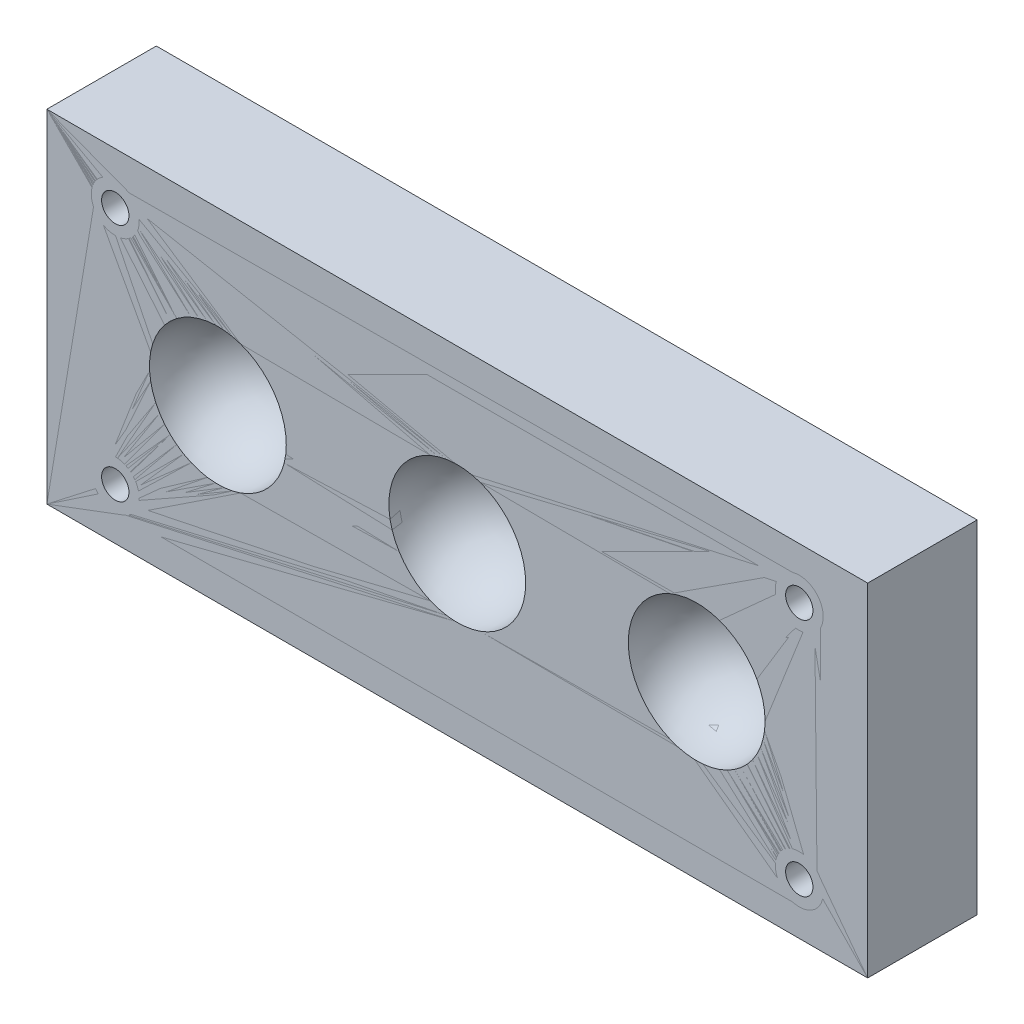
ISO-10303-21;
HEADER;
FILE_DESCRIPTION(('STEP AP214'),'2;1');
FILE_NAME('part.step','',(''),(''),'','','');
FILE_SCHEMA(('AUTOMOTIVE_DESIGN { 1 0 10303 214 1 1 1 1 }'));
ENDSEC;
DATA;
#1=APPLICATION_CONTEXT('core data for automotive mechanical design processes');
#2=APPLICATION_PROTOCOL_DEFINITION('international standard','automotive_design',2000,#1);
#3=PRODUCT_CONTEXT('',#1,'mechanical');
#4=PRODUCT('Part','Part','',(#3));
#5=PRODUCT_RELATED_PRODUCT_CATEGORY('part','',(#4));
#6=PRODUCT_DEFINITION_FORMATION('','',#4);
#7=PRODUCT_DEFINITION_CONTEXT('part definition',#1,'design');
#8=PRODUCT_DEFINITION('design','',#6,#7);
#9=PRODUCT_DEFINITION_SHAPE('','',#8);
#10=(LENGTH_UNIT() NAMED_UNIT(*) SI_UNIT(.MILLI.,.METRE.));
#11=(NAMED_UNIT(*) PLANE_ANGLE_UNIT() SI_UNIT($,.RADIAN.));
#12=(NAMED_UNIT(*) SI_UNIT($,.STERADIAN.) SOLID_ANGLE_UNIT());
#13=UNCERTAINTY_MEASURE_WITH_UNIT(LENGTH_MEASURE(1.E-05),#10,'distance_accuracy_value','');
#14=(GEOMETRIC_REPRESENTATION_CONTEXT(3) GLOBAL_UNCERTAINTY_ASSIGNED_CONTEXT((#13)) GLOBAL_UNIT_ASSIGNED_CONTEXT((#10,
#11,#12)) REPRESENTATION_CONTEXT('',''));
#15=CARTESIAN_POINT('',(0.,0.,0.));
#16=DIRECTION('',(0.,0.,1.));
#17=DIRECTION('',(1.,0.,0.));
#18=AXIS2_PLACEMENT_3D('',#15,#16,#17);
#19=CARTESIAN_POINT('',(35.,0.,0.));
#20=DIRECTION('',(1.,0.,0.));
#21=DIRECTION('',(0.,1.,0.));
#22=AXIS2_PLACEMENT_3D('',#19,#20,#21);
#23=SPHERICAL_SURFACE('',#22,10.);
#24=CARTESIAN_POINT('',(35.,0.,0.));
#25=DIRECTION('',(0.,0.,1.));
#26=DIRECTION('',(1.,0.,0.));
#27=AXIS2_PLACEMENT_3D('',#24,#25,#26);
#28=SPHERICAL_SURFACE('',#27,10.);
#29=CARTESIAN_POINT('',(35.,0.,0.));
#30=DIRECTION('',(0.,0.,1.));
#31=DIRECTION('',(1.,0.,0.));
#32=AXIS2_PLACEMENT_3D('',#29,#30,#31);
#33=CIRCLE('',#32,10.);
#34=CARTESIAN_POINT('',(45.,0.,0.));
#35=VERTEX_POINT('',#34);
#36=EDGE_CURVE('P0_E74',#35,#35,#33,.T.);
#37=ORIENTED_EDGE('',*,*,#36,.T.);
#38=EDGE_LOOP('',(#37));
#39=FACE_BOUND('',#38,.T.);
#40=ADVANCED_FACE('P0_F47',(#39),#28,.F.);
#41=CARTESIAN_POINT('',(0.,0.,0.));
#42=DIRECTION('',(1.,0.,0.));
#43=DIRECTION('',(0.,1.,0.));
#44=AXIS2_PLACEMENT_3D('',#41,#42,#43);
#45=SPHERICAL_SURFACE('',#44,10.);
#46=CARTESIAN_POINT('',(0.,0.,0.));
#47=DIRECTION('',(0.,0.,1.));
#48=DIRECTION('',(1.,0.,0.));
#49=AXIS2_PLACEMENT_3D('',#46,#47,#48);
#50=SPHERICAL_SURFACE('',#49,10.);
#51=CARTESIAN_POINT('',(0.,0.,0.));
#52=DIRECTION('',(0.,0.,1.));
#53=DIRECTION('',(1.,0.,0.));
#54=AXIS2_PLACEMENT_3D('',#51,#52,#53);
#55=CIRCLE('',#54,10.);
#56=CARTESIAN_POINT('',(10.,0.,0.));
#57=VERTEX_POINT('',#56);
#58=EDGE_CURVE('P0_E56',#57,#57,#55,.T.);
#59=ORIENTED_EDGE('',*,*,#58,.T.);
#60=EDGE_LOOP('',(#59));
#61=FACE_BOUND('',#60,.T.);
#62=ADVANCED_FACE('P0_F179',(#61),#50,.F.);
#63=CARTESIAN_POINT('',(-35.,0.,0.));
#64=DIRECTION('',(1.,0.,0.));
#65=DIRECTION('',(0.,1.,0.));
#66=AXIS2_PLACEMENT_3D('',#63,#64,#65);
#67=SPHERICAL_SURFACE('',#66,10.);
#68=CARTESIAN_POINT('',(-35.,0.,0.));
#69=DIRECTION('',(0.,0.,1.));
#70=DIRECTION('',(1.,0.,0.));
#71=AXIS2_PLACEMENT_3D('',#68,#69,#70);
#72=SPHERICAL_SURFACE('',#71,10.);
#73=CARTESIAN_POINT('',(-35.,0.,0.));
#74=DIRECTION('',(0.,0.,1.));
#75=DIRECTION('',(1.,0.,0.));
#76=AXIS2_PLACEMENT_3D('',#73,#74,#75);
#77=CIRCLE('',#76,10.);
#78=CARTESIAN_POINT('',(-25.,0.,0.));
#79=VERTEX_POINT('',#78);
#80=EDGE_CURVE('P0_E11',#79,#79,#77,.T.);
#81=ORIENTED_EDGE('',*,*,#80,.T.);
#82=EDGE_LOOP('',(#81));
#83=FACE_BOUND('',#82,.T.);
#84=ADVANCED_FACE('P0_F169',(#83),#72,.F.);
#85=CARTESIAN_POINT('',(0.,0.,0.));
#86=DIRECTION('',(0.,0.,1.));
#87=DIRECTION('',(1.,0.,0.));
#88=AXIS2_PLACEMENT_3D('',#85,#86,#87);
#89=PLANE('',#88);
#90=CARTESIAN_POINT('',(-50.,-17.5,0.));
#91=DIRECTION('',(0.,0.,1.));
#92=DIRECTION('',(1.,0.,0.));
#93=AXIS2_PLACEMENT_3D('',#90,#91,#92);
#94=CIRCLE('',#93,3.5);
#95=CARTESIAN_POINT('',(-46.5,-17.5,0.));
#96=VERTEX_POINT('',#95);
#97=EDGE_CURVE('P0_E134',#96,#96,#94,.T.);
#98=ORIENTED_EDGE('',*,*,#97,.F.);
#99=EDGE_LOOP('',(#98));
#100=FACE_BOUND('',#99,.T.);
#101=CARTESIAN_POINT('',(50.,17.5,0.));
#102=DIRECTION('',(0.,0.,1.));
#103=DIRECTION('',(1.,0.,0.));
#104=AXIS2_PLACEMENT_3D('',#101,#102,#103);
#105=CIRCLE('',#104,3.5);
#106=CARTESIAN_POINT('',(53.5,17.5,0.));
#107=VERTEX_POINT('',#106);
#108=EDGE_CURVE('P0_E142',#107,#107,#105,.T.);
#109=ORIENTED_EDGE('',*,*,#108,.F.);
#110=EDGE_LOOP('',(#109));
#111=FACE_BOUND('',#110,.T.);
#112=CARTESIAN_POINT('',(50.,-17.5,0.));
#113=DIRECTION('',(0.,0.,1.));
#114=DIRECTION('',(1.,0.,0.));
#115=AXIS2_PLACEMENT_3D('',#112,#113,#114);
#116=CIRCLE('',#115,3.5);
#117=CARTESIAN_POINT('',(53.5,-17.5,0.));
#118=VERTEX_POINT('',#117);
#119=EDGE_CURVE('P0_E143',#118,#118,#116,.T.);
#120=ORIENTED_EDGE('',*,*,#119,.F.);
#121=EDGE_LOOP('',(#120));
#122=FACE_BOUND('',#121,.T.);
#123=CARTESIAN_POINT('',(-50.,17.5,0.));
#124=DIRECTION('',(0.,0.,1.));
#125=DIRECTION('',(1.,0.,0.));
#126=AXIS2_PLACEMENT_3D('',#123,#124,#125);
#127=CIRCLE('',#126,3.5);
#128=CARTESIAN_POINT('',(-46.5,17.5,0.));
#129=VERTEX_POINT('',#128);
#130=EDGE_CURVE('P0_E130',#129,#129,#127,.T.);
#131=ORIENTED_EDGE('',*,*,#130,.F.);
#132=EDGE_LOOP('',(#131));
#133=FACE_BOUND('',#132,.T.);
#134=DIRECTION('',(1.,0.,0.));
#135=VECTOR('',#134,1.);
#136=CARTESIAN_POINT('',(-60.,-25.,0.));
#137=LINE('',#136,#135);
#138=CARTESIAN_POINT('',(-60.,-25.,0.));
#139=VERTEX_POINT('',#138);
#140=CARTESIAN_POINT('',(60.,-25.,0.));
#141=VERTEX_POINT('',#140);
#142=EDGE_CURVE('P0_E122',#139,#141,#137,.T.);
#143=ORIENTED_EDGE('',*,*,#142,.T.);
#144=DIRECTION('',(0.,1.,0.));
#145=VECTOR('',#144,1.);
#146=CARTESIAN_POINT('',(60.,-25.,0.));
#147=LINE('',#146,#145);
#148=CARTESIAN_POINT('',(60.,25.,0.));
#149=VERTEX_POINT('',#148);
#150=EDGE_CURVE('P0_E100',#141,#149,#147,.T.);
#151=ORIENTED_EDGE('',*,*,#150,.T.);
#152=DIRECTION('',(-1.,0.,0.));
#153=VECTOR('',#152,1.);
#154=CARTESIAN_POINT('',(60.,25.,0.));
#155=LINE('',#154,#153);
#156=CARTESIAN_POINT('',(-60.,25.,0.));
#157=VERTEX_POINT('',#156);
#158=EDGE_CURVE('P0_E94',#149,#157,#155,.T.);
#159=ORIENTED_EDGE('',*,*,#158,.T.);
#160=DIRECTION('',(0.,-1.,0.));
#161=VECTOR('',#160,1.);
#162=CARTESIAN_POINT('',(-60.,25.,0.));
#163=LINE('',#162,#161);
#164=EDGE_CURVE('P0_E83',#157,#139,#163,.T.);
#165=ORIENTED_EDGE('',*,*,#164,.T.);
#166=EDGE_LOOP('',(#143,#151,#159,#165));
#167=FACE_BOUND('',#166,.T.);
#168=ORIENTED_EDGE('',*,*,#80,.F.);
#169=EDGE_LOOP('',(#168));
#170=FACE_BOUND('',#169,.T.);
#171=ORIENTED_EDGE('',*,*,#58,.F.);
#172=EDGE_LOOP('',(#171));
#173=FACE_BOUND('',#172,.T.);
#174=ORIENTED_EDGE('',*,*,#36,.F.);
#175=EDGE_LOOP('',(#174));
#176=FACE_BOUND('',#175,.T.);
#177=ADVANCED_FACE('P0_F165',(#100,#111,#122,#133,#167,#170,#173,#176),#89,.T.);
#178=CARTESIAN_POINT('',(0.,0.,-16.));
#179=DIRECTION('',(0.,0.,1.));
#180=DIRECTION('',(1.,0.,0.));
#181=AXIS2_PLACEMENT_3D('',#178,#179,#180);
#182=PLANE('',#181);
#183=CARTESIAN_POINT('',(-50.,-17.5,-16.));
#184=DIRECTION('',(0.,0.,1.));
#185=DIRECTION('',(1.,0.,0.));
#186=AXIS2_PLACEMENT_3D('',#183,#184,#185);
#187=CIRCLE('',#186,3.5);
#188=CARTESIAN_POINT('',(-46.5,-17.5,-16.));
#189=VERTEX_POINT('',#188);
#190=EDGE_CURVE('P0_E147',#189,#189,#187,.T.);
#191=ORIENTED_EDGE('',*,*,#190,.T.);
#192=EDGE_LOOP('',(#191));
#193=FACE_BOUND('',#192,.T.);
#194=CARTESIAN_POINT('',(50.,17.5,-16.));
#195=DIRECTION('',(0.,0.,1.));
#196=DIRECTION('',(1.,0.,0.));
#197=AXIS2_PLACEMENT_3D('',#194,#195,#196);
#198=CIRCLE('',#197,3.5);
#199=CARTESIAN_POINT('',(53.5,17.5,-16.));
#200=VERTEX_POINT('',#199);
#201=EDGE_CURVE('P0_E138',#200,#200,#198,.T.);
#202=ORIENTED_EDGE('',*,*,#201,.T.);
#203=EDGE_LOOP('',(#202));
#204=FACE_BOUND('',#203,.T.);
#205=CARTESIAN_POINT('',(50.,-17.5,-16.));
#206=DIRECTION('',(0.,0.,1.));
#207=DIRECTION('',(1.,0.,0.));
#208=AXIS2_PLACEMENT_3D('',#205,#206,#207);
#209=CIRCLE('',#208,3.5);
#210=CARTESIAN_POINT('',(53.5,-17.5,-16.));
#211=VERTEX_POINT('',#210);
#212=EDGE_CURVE('P0_E154',#211,#211,#209,.T.);
#213=ORIENTED_EDGE('',*,*,#212,.T.);
#214=EDGE_LOOP('',(#213));
#215=FACE_BOUND('',#214,.T.);
#216=CARTESIAN_POINT('',(-50.,17.5,-16.));
#217=DIRECTION('',(0.,0.,1.));
#218=DIRECTION('',(1.,0.,0.));
#219=AXIS2_PLACEMENT_3D('',#216,#217,#218);
#220=CIRCLE('',#219,3.5);
#221=CARTESIAN_POINT('',(-46.5,17.5,-16.));
#222=VERTEX_POINT('',#221);
#223=EDGE_CURVE('P0_E126',#222,#222,#220,.T.);
#224=ORIENTED_EDGE('',*,*,#223,.T.);
#225=EDGE_LOOP('',(#224));
#226=FACE_BOUND('',#225,.T.);
#227=DIRECTION('',(1.,0.,0.));
#228=VECTOR('',#227,1.);
#229=CARTESIAN_POINT('',(-60.,-25.,-16.));
#230=LINE('',#229,#228);
#231=CARTESIAN_POINT('',(-60.,-25.,-16.));
#232=VERTEX_POINT('',#231);
#233=CARTESIAN_POINT('',(60.,-25.,-16.));
#234=VERTEX_POINT('',#233);
#235=EDGE_CURVE('P0_E111',#232,#234,#230,.T.);
#236=ORIENTED_EDGE('',*,*,#235,.F.);
#237=DIRECTION('',(0.,-1.,0.));
#238=VECTOR('',#237,1.);
#239=CARTESIAN_POINT('',(-60.,25.,-16.));
#240=LINE('',#239,#238);
#241=CARTESIAN_POINT('',(-60.,25.,-16.));
#242=VERTEX_POINT('',#241);
#243=EDGE_CURVE('P0_E77',#242,#232,#240,.T.);
#244=ORIENTED_EDGE('',*,*,#243,.F.);
#245=DIRECTION('',(-1.,0.,0.));
#246=VECTOR('',#245,1.);
#247=CARTESIAN_POINT('',(60.,25.,-16.));
#248=LINE('',#247,#246);
#249=CARTESIAN_POINT('',(60.,25.,-16.));
#250=VERTEX_POINT('',#249);
#251=EDGE_CURVE('P0_E90',#250,#242,#248,.T.);
#252=ORIENTED_EDGE('',*,*,#251,.F.);
#253=DIRECTION('',(0.,1.,0.));
#254=VECTOR('',#253,1.);
#255=CARTESIAN_POINT('',(60.,-25.,-16.));
#256=LINE('',#255,#254);
#257=EDGE_CURVE('P0_E95',#234,#250,#256,.T.);
#258=ORIENTED_EDGE('',*,*,#257,.F.);
#259=EDGE_LOOP('',(#236,#244,#252,#258));
#260=FACE_BOUND('',#259,.T.);
#261=ADVANCED_FACE('P0_F168',(#193,#204,#215,#226,#260),#182,.F.);
#262=CARTESIAN_POINT('',(-60.,25.,-16.));
#263=DIRECTION('',(-1.,0.,0.));
#264=DIRECTION('',(0.,0.,1.));
#265=AXIS2_PLACEMENT_3D('',#262,#263,#264);
#266=PLANE('',#265);
#267=ORIENTED_EDGE('',*,*,#164,.F.);
#268=DIRECTION('',(0.,0.,1.));
#269=VECTOR('',#268,1.);
#270=CARTESIAN_POINT('',(-60.,25.,-16.));
#271=LINE('',#270,#269);
#272=EDGE_CURVE('P0_E89',#242,#157,#271,.T.);
#273=ORIENTED_EDGE('',*,*,#272,.F.);
#274=ORIENTED_EDGE('',*,*,#243,.T.);
#275=DIRECTION('',(0.,0.,1.));
#276=VECTOR('',#275,1.);
#277=CARTESIAN_POINT('',(-60.,-25.,-16.));
#278=LINE('',#277,#276);
#279=EDGE_CURVE('P0_E115',#232,#139,#278,.T.);
#280=ORIENTED_EDGE('',*,*,#279,.T.);
#281=EDGE_LOOP('',(#267,#273,#274,#280));
#282=FACE_BOUND('',#281,.T.);
#283=ADVANCED_FACE('P0_F194',(#282),#266,.T.);
#284=CARTESIAN_POINT('',(60.,25.,-16.));
#285=DIRECTION('',(0.,1.,0.));
#286=DIRECTION('',(1.,0.,0.));
#287=AXIS2_PLACEMENT_3D('',#284,#285,#286);
#288=PLANE('',#287);
#289=ORIENTED_EDGE('',*,*,#158,.F.);
#290=DIRECTION('',(0.,0.,1.));
#291=VECTOR('',#290,1.);
#292=CARTESIAN_POINT('',(60.,25.,-16.));
#293=LINE('',#292,#291);
#294=EDGE_CURVE('P0_E99',#250,#149,#293,.T.);
#295=ORIENTED_EDGE('',*,*,#294,.F.);
#296=ORIENTED_EDGE('',*,*,#251,.T.);
#297=ORIENTED_EDGE('',*,*,#272,.T.);
#298=EDGE_LOOP('',(#289,#295,#296,#297));
#299=FACE_BOUND('',#298,.T.);
#300=ADVANCED_FACE('P0_F191',(#299),#288,.T.);
#301=CARTESIAN_POINT('',(60.,-25.,-16.));
#302=DIRECTION('',(1.,0.,0.));
#303=DIRECTION('',(0.,1.,0.));
#304=AXIS2_PLACEMENT_3D('',#301,#302,#303);
#305=PLANE('',#304);
#306=ORIENTED_EDGE('',*,*,#150,.F.);
#307=DIRECTION('',(0.,0.,1.));
#308=VECTOR('',#307,1.);
#309=CARTESIAN_POINT('',(60.,-25.,-16.));
#310=LINE('',#309,#308);
#311=EDGE_CURVE('P0_E104',#234,#141,#310,.T.);
#312=ORIENTED_EDGE('',*,*,#311,.F.);
#313=ORIENTED_EDGE('',*,*,#257,.T.);
#314=ORIENTED_EDGE('',*,*,#294,.T.);
#315=EDGE_LOOP('',(#306,#312,#313,#314));
#316=FACE_BOUND('',#315,.T.);
#317=ADVANCED_FACE('P0_F189',(#316),#305,.T.);
#318=CARTESIAN_POINT('',(-60.,-25.,-16.));
#319=DIRECTION('',(0.,-1.,0.));
#320=DIRECTION('',(0.,0.,-1.));
#321=AXIS2_PLACEMENT_3D('',#318,#319,#320);
#322=PLANE('',#321);
#323=ORIENTED_EDGE('',*,*,#142,.F.);
#324=ORIENTED_EDGE('',*,*,#279,.F.);
#325=ORIENTED_EDGE('',*,*,#235,.T.);
#326=ORIENTED_EDGE('',*,*,#311,.T.);
#327=EDGE_LOOP('',(#323,#324,#325,#326));
#328=FACE_BOUND('',#327,.T.);
#329=ADVANCED_FACE('P0_F222',(#328),#322,.T.);
#330=CARTESIAN_POINT('',(-50.,17.5,-16.));
#331=DIRECTION('',(0.,0.,1.));
#332=DIRECTION('',(1.,0.,0.));
#333=AXIS2_PLACEMENT_3D('',#330,#331,#332);
#334=CYLINDRICAL_SURFACE('',#333,3.5);
#335=ORIENTED_EDGE('',*,*,#223,.F.);
#336=EDGE_LOOP('',(#335));
#337=FACE_BOUND('',#336,.T.);
#338=ORIENTED_EDGE('',*,*,#130,.T.);
#339=EDGE_LOOP('',(#338));
#340=FACE_BOUND('',#339,.T.);
#341=ADVANCED_FACE('P0_F236',(#337,#340),#334,.F.);
#342=CARTESIAN_POINT('',(50.,-17.5,-16.));
#343=DIRECTION('',(0.,0.,1.));
#344=DIRECTION('',(1.,0.,0.));
#345=AXIS2_PLACEMENT_3D('',#342,#343,#344);
#346=CYLINDRICAL_SURFACE('',#345,3.5);
#347=ORIENTED_EDGE('',*,*,#212,.F.);
#348=EDGE_LOOP('',(#347));
#349=FACE_BOUND('',#348,.T.);
#350=ORIENTED_EDGE('',*,*,#119,.T.);
#351=EDGE_LOOP('',(#350));
#352=FACE_BOUND('',#351,.T.);
#353=ADVANCED_FACE('P0_F163',(#349,#352),#346,.F.);
#354=CARTESIAN_POINT('',(50.,17.5,-16.));
#355=DIRECTION('',(0.,0.,1.));
#356=DIRECTION('',(1.,0.,0.));
#357=AXIS2_PLACEMENT_3D('',#354,#355,#356);
#358=CYLINDRICAL_SURFACE('',#357,3.5);
#359=ORIENTED_EDGE('',*,*,#201,.F.);
#360=EDGE_LOOP('',(#359));
#361=FACE_BOUND('',#360,.T.);
#362=ORIENTED_EDGE('',*,*,#108,.T.);
#363=EDGE_LOOP('',(#362));
#364=FACE_BOUND('',#363,.T.);
#365=ADVANCED_FACE('P0_F242',(#361,#364),#358,.F.);
#366=CARTESIAN_POINT('',(-50.,-17.5,-16.));
#367=DIRECTION('',(0.,0.,1.));
#368=DIRECTION('',(1.,0.,0.));
#369=AXIS2_PLACEMENT_3D('',#366,#367,#368);
#370=CYLINDRICAL_SURFACE('',#369,3.5);
#371=ORIENTED_EDGE('',*,*,#190,.F.);
#372=EDGE_LOOP('',(#371));
#373=FACE_BOUND('',#372,.T.);
#374=ORIENTED_EDGE('',*,*,#97,.T.);
#375=EDGE_LOOP('',(#374));
#376=FACE_BOUND('',#375,.T.);
#377=ADVANCED_FACE('P0_F245',(#373,#376),#370,.F.);
#378=CLOSED_SHELL('',(#40,#62,#84,#177,#261,#283,#300,#317,#329,#341,#353,#365,#377));
#379=MANIFOLD_SOLID_BREP('P0_B2',#378);
#380=CARTESIAN_POINT('',(35.,0.,0.));
#381=DIRECTION('',(1.,0.,0.));
#382=DIRECTION('',(0.,1.,0.));
#383=AXIS2_PLACEMENT_3D('',#380,#381,#382);
#384=SPHERICAL_SURFACE('',#383,10.);
#385=CARTESIAN_POINT('',(35.,0.,0.));
#386=DIRECTION('',(0.,0.,1.));
#387=DIRECTION('',(1.,0.,0.));
#388=AXIS2_PLACEMENT_3D('',#385,#386,#387);
#389=SPHERICAL_SURFACE('',#388,10.);
#390=CARTESIAN_POINT('',(35.,0.,0.));
#391=DIRECTION('',(0.,0.,1.));
#392=DIRECTION('',(1.,0.,0.));
#393=AXIS2_PLACEMENT_3D('',#390,#391,#392);
#394=CIRCLE('',#393,10.);
#395=CARTESIAN_POINT('',(45.,0.,0.));
#396=VERTEX_POINT('',#395);
#397=EDGE_CURVE('P1_E177',#396,#396,#394,.T.);
#398=ORIENTED_EDGE('',*,*,#397,.T.);
#399=EDGE_LOOP('',(#398));
#400=FACE_BOUND('',#399,.T.);
#401=ADVANCED_FACE('P1_F16',(#400),#389,.F.);
#402=CARTESIAN_POINT('',(0.,0.,0.));
#403=DIRECTION('',(1.,0.,0.));
#404=DIRECTION('',(0.,1.,0.));
#405=AXIS2_PLACEMENT_3D('',#402,#403,#404);
#406=SPHERICAL_SURFACE('',#405,10.);
#407=CARTESIAN_POINT('',(0.,0.,0.));
#408=DIRECTION('',(0.,0.,1.));
#409=DIRECTION('',(1.,0.,0.));
#410=AXIS2_PLACEMENT_3D('',#407,#408,#409);
#411=SPHERICAL_SURFACE('',#410,10.);
#412=CARTESIAN_POINT('',(0.,0.,0.));
#413=DIRECTION('',(0.,0.,1.));
#414=DIRECTION('',(1.,0.,0.));
#415=AXIS2_PLACEMENT_3D('',#412,#413,#414);
#416=CIRCLE('',#415,10.);
#417=CARTESIAN_POINT('',(10.,0.,0.));
#418=VERTEX_POINT('',#417);
#419=EDGE_CURVE('P1_E180',#418,#418,#416,.T.);
#420=ORIENTED_EDGE('',*,*,#419,.T.);
#421=EDGE_LOOP('',(#420));
#422=FACE_BOUND('',#421,.T.);
#423=ADVANCED_FACE('P1_F204',(#422),#411,.F.);
#424=CARTESIAN_POINT('',(-35.,0.,0.));
#425=DIRECTION('',(1.,0.,0.));
#426=DIRECTION('',(0.,1.,0.));
#427=AXIS2_PLACEMENT_3D('',#424,#425,#426);
#428=SPHERICAL_SURFACE('',#427,10.);
#429=CARTESIAN_POINT('',(-35.,0.,0.));
#430=DIRECTION('',(0.,0.,1.));
#431=DIRECTION('',(1.,0.,0.));
#432=AXIS2_PLACEMENT_3D('',#429,#430,#431);
#433=SPHERICAL_SURFACE('',#432,10.);
#434=CARTESIAN_POINT('',(-35.,0.,0.));
#435=DIRECTION('',(0.,0.,1.));
#436=DIRECTION('',(1.,0.,0.));
#437=AXIS2_PLACEMENT_3D('',#434,#435,#436);
#438=CIRCLE('',#437,10.);
#439=CARTESIAN_POINT('',(-25.,0.,0.));
#440=VERTEX_POINT('',#439);
#441=EDGE_CURVE('P1_E183',#440,#440,#438,.T.);
#442=ORIENTED_EDGE('',*,*,#441,.T.);
#443=EDGE_LOOP('',(#442));
#444=FACE_BOUND('',#443,.T.);
#445=ADVANCED_FACE('P1_F198',(#444),#433,.F.);
#446=CARTESIAN_POINT('',(50.,17.5,-38.0953181031254));
#447=DIRECTION('',(0.,0.,1.));
#448=DIRECTION('',(1.,0.,0.));
#449=AXIS2_PLACEMENT_3D('',#446,#447,#448);
#450=CYLINDRICAL_SURFACE('',#449,2.);
#451=CARTESIAN_POINT('',(50.,17.5,-16.));
#452=DIRECTION('',(0.,0.,-1.));
#453=DIRECTION('',(1.,0.,0.));
#454=AXIS2_PLACEMENT_3D('',#451,#452,#453);
#455=CIRCLE('',#454,2.);
#456=CARTESIAN_POINT('',(52.,17.5,-16.));
#457=VERTEX_POINT('',#456);
#458=EDGE_CURVE('P1_E146',#457,#457,#455,.T.);
#459=ORIENTED_EDGE('',*,*,#458,.T.);
#460=EDGE_LOOP('',(#459));
#461=FACE_BOUND('',#460,.T.);
#462=CARTESIAN_POINT('',(50.,17.5,0.));
#463=DIRECTION('',(0.,0.,-1.));
#464=DIRECTION('',(1.,0.,0.));
#465=AXIS2_PLACEMENT_3D('',#462,#463,#464);
#466=CIRCLE('',#465,2.);
#467=CARTESIAN_POINT('',(52.,17.5,0.));
#468=VERTEX_POINT('',#467);
#469=EDGE_CURVE('P1_E186',#468,#468,#466,.T.);
#470=ORIENTED_EDGE('',*,*,#469,.F.);
#471=EDGE_LOOP('',(#470));
#472=FACE_BOUND('',#471,.T.);
#473=ADVANCED_FACE('P1_F203',(#461,#472),#450,.F.);
#474=CARTESIAN_POINT('',(50.,-17.5,-38.0953181031254));
#475=DIRECTION('',(0.,0.,1.));
#476=DIRECTION('',(1.,0.,0.));
#477=AXIS2_PLACEMENT_3D('',#474,#475,#476);
#478=CYLINDRICAL_SURFACE('',#477,2.);
#479=CARTESIAN_POINT('',(50.,-17.5,-16.));
#480=DIRECTION('',(0.,0.,-1.));
#481=DIRECTION('',(1.,0.,0.));
#482=AXIS2_PLACEMENT_3D('',#479,#480,#481);
#483=CIRCLE('',#482,2.);
#484=CARTESIAN_POINT('',(52.,-17.5,-16.));
#485=VERTEX_POINT('',#484);
#486=EDGE_CURVE('P1_E168',#485,#485,#483,.T.);
#487=ORIENTED_EDGE('',*,*,#486,.T.);
#488=EDGE_LOOP('',(#487));
#489=FACE_BOUND('',#488,.T.);
#490=CARTESIAN_POINT('',(50.,-17.5,0.));
#491=DIRECTION('',(0.,0.,-1.));
#492=DIRECTION('',(1.,0.,0.));
#493=AXIS2_PLACEMENT_3D('',#490,#491,#492);
#494=CIRCLE('',#493,2.);
#495=CARTESIAN_POINT('',(52.,-17.5,0.));
#496=VERTEX_POINT('',#495);
#497=EDGE_CURVE('P1_E189',#496,#496,#494,.T.);
#498=ORIENTED_EDGE('',*,*,#497,.F.);
#499=EDGE_LOOP('',(#498));
#500=FACE_BOUND('',#499,.T.);
#501=ADVANCED_FACE('P1_F257',(#489,#500),#478,.F.);
#502=CARTESIAN_POINT('',(-50.,17.5,-38.0953181031254));
#503=DIRECTION('',(0.,0.,1.));
#504=DIRECTION('',(1.,0.,0.));
#505=AXIS2_PLACEMENT_3D('',#502,#503,#504);
#506=CYLINDRICAL_SURFACE('',#505,2.);
#507=CARTESIAN_POINT('',(-50.,17.5,-16.));
#508=DIRECTION('',(0.,0.,-1.));
#509=DIRECTION('',(1.,0.,0.));
#510=AXIS2_PLACEMENT_3D('',#507,#508,#509);
#511=CIRCLE('',#510,2.);
#512=CARTESIAN_POINT('',(-48.,17.5,-16.));
#513=VERTEX_POINT('',#512);
#514=EDGE_CURVE('P1_E171',#513,#513,#511,.T.);
#515=ORIENTED_EDGE('',*,*,#514,.T.);
#516=EDGE_LOOP('',(#515));
#517=FACE_BOUND('',#516,.T.);
#518=CARTESIAN_POINT('',(-50.,17.5,0.));
#519=DIRECTION('',(0.,0.,-1.));
#520=DIRECTION('',(1.,0.,0.));
#521=AXIS2_PLACEMENT_3D('',#518,#519,#520);
#522=CIRCLE('',#521,2.);
#523=CARTESIAN_POINT('',(-48.,17.5,0.));
#524=VERTEX_POINT('',#523);
#525=EDGE_CURVE('P1_E24',#524,#524,#522,.T.);
#526=ORIENTED_EDGE('',*,*,#525,.F.);
#527=EDGE_LOOP('',(#526));
#528=FACE_BOUND('',#527,.T.);
#529=ADVANCED_FACE('P1_F251',(#517,#528),#506,.F.);
#530=CARTESIAN_POINT('',(-50.,-17.5,-38.0953181031254));
#531=DIRECTION('',(0.,0.,1.));
#532=DIRECTION('',(1.,0.,0.));
#533=AXIS2_PLACEMENT_3D('',#530,#531,#532);
#534=CYLINDRICAL_SURFACE('',#533,2.);
#535=CARTESIAN_POINT('',(-50.,-17.5,-16.));
#536=DIRECTION('',(0.,0.,-1.));
#537=DIRECTION('',(1.,0.,0.));
#538=AXIS2_PLACEMENT_3D('',#535,#536,#537);
#539=CIRCLE('',#538,2.);
#540=CARTESIAN_POINT('',(-48.,-17.5,-16.));
#541=VERTEX_POINT('',#540);
#542=EDGE_CURVE('P1_E174',#541,#541,#539,.T.);
#543=ORIENTED_EDGE('',*,*,#542,.T.);
#544=EDGE_LOOP('',(#543));
#545=FACE_BOUND('',#544,.T.);
#546=CARTESIAN_POINT('',(-50.,-17.5,0.));
#547=DIRECTION('',(0.,0.,-1.));
#548=DIRECTION('',(1.,0.,0.));
#549=AXIS2_PLACEMENT_3D('',#546,#547,#548);
#550=CIRCLE('',#549,2.);
#551=CARTESIAN_POINT('',(-48.,-17.5,0.));
#552=VERTEX_POINT('',#551);
#553=EDGE_CURVE('P1_E11',#552,#552,#550,.T.);
#554=ORIENTED_EDGE('',*,*,#553,.F.);
#555=EDGE_LOOP('',(#554));
#556=FACE_BOUND('',#555,.T.);
#557=ADVANCED_FACE('P1_F256',(#545,#556),#534,.F.);
#558=CARTESIAN_POINT('',(0.,0.,0.));
#559=DIRECTION('',(0.,0.,1.));
#560=DIRECTION('',(1.,0.,0.));
#561=AXIS2_PLACEMENT_3D('',#558,#559,#560);
#562=PLANE('',#561);
#563=DIRECTION('',(1.,0.,0.));
#564=VECTOR('',#563,1.);
#565=CARTESIAN_POINT('',(-60.,-25.,0.));
#566=LINE('',#565,#564);
#567=CARTESIAN_POINT('',(-60.,-25.,0.));
#568=VERTEX_POINT('',#567);
#569=CARTESIAN_POINT('',(60.,-25.,0.));
#570=VERTEX_POINT('',#569);
#571=EDGE_CURVE('P1_E115',#568,#570,#566,.T.);
#572=ORIENTED_EDGE('',*,*,#571,.T.);
#573=DIRECTION('',(0.,1.,0.));
#574=VECTOR('',#573,1.);
#575=CARTESIAN_POINT('',(60.,-25.,0.));
#576=LINE('',#575,#574);
#577=CARTESIAN_POINT('',(60.,25.,0.));
#578=VERTEX_POINT('',#577);
#579=EDGE_CURVE('P1_E154',#570,#578,#576,.T.);
#580=ORIENTED_EDGE('',*,*,#579,.T.);
#581=DIRECTION('',(-1.,0.,0.));
#582=VECTOR('',#581,1.);
#583=CARTESIAN_POINT('',(60.,25.,0.));
#584=LINE('',#583,#582);
#585=CARTESIAN_POINT('',(-60.,25.,0.));
#586=VERTEX_POINT('',#585);
#587=EDGE_CURVE('P1_E116',#578,#586,#584,.T.);
#588=ORIENTED_EDGE('',*,*,#587,.T.);
#589=DIRECTION('',(0.,-1.,0.));
#590=VECTOR('',#589,1.);
#591=CARTESIAN_POINT('',(-60.,25.,0.));
#592=LINE('',#591,#590);
#593=EDGE_CURVE('P1_E110',#586,#568,#592,.T.);
#594=ORIENTED_EDGE('',*,*,#593,.T.);
#595=EDGE_LOOP('',(#572,#580,#588,#594));
#596=FACE_BOUND('',#595,.T.);
#597=ORIENTED_EDGE('',*,*,#553,.T.);
#598=EDGE_LOOP('',(#597));
#599=FACE_BOUND('',#598,.T.);
#600=ORIENTED_EDGE('',*,*,#525,.T.);
#601=EDGE_LOOP('',(#600));
#602=FACE_BOUND('',#601,.T.);
#603=ORIENTED_EDGE('',*,*,#497,.T.);
#604=EDGE_LOOP('',(#603));
#605=FACE_BOUND('',#604,.T.);
#606=ORIENTED_EDGE('',*,*,#469,.T.);
#607=EDGE_LOOP('',(#606));
#608=FACE_BOUND('',#607,.T.);
#609=ORIENTED_EDGE('',*,*,#441,.F.);
#610=EDGE_LOOP('',(#609));
#611=FACE_BOUND('',#610,.T.);
#612=ORIENTED_EDGE('',*,*,#419,.F.);
#613=EDGE_LOOP('',(#612));
#614=FACE_BOUND('',#613,.T.);
#615=ORIENTED_EDGE('',*,*,#397,.F.);
#616=EDGE_LOOP('',(#615));
#617=FACE_BOUND('',#616,.T.);
#618=ADVANCED_FACE('P1_F112',(#596,#599,#602,#605,#608,#611,#614,#617),#562,.T.);
#619=CARTESIAN_POINT('',(0.,0.,-16.));
#620=DIRECTION('',(0.,0.,1.));
#621=DIRECTION('',(1.,0.,0.));
#622=AXIS2_PLACEMENT_3D('',#619,#620,#621);
#623=PLANE('',#622);
#624=DIRECTION('',(1.,0.,0.));
#625=VECTOR('',#624,1.);
#626=CARTESIAN_POINT('',(-60.,-25.,-16.));
#627=LINE('',#626,#625);
#628=CARTESIAN_POINT('',(-60.,-25.,-16.));
#629=VERTEX_POINT('',#628);
#630=CARTESIAN_POINT('',(60.,-25.,-16.));
#631=VERTEX_POINT('',#630);
#632=EDGE_CURVE('P1_E131',#629,#631,#627,.T.);
#633=ORIENTED_EDGE('',*,*,#632,.F.);
#634=DIRECTION('',(0.,-1.,0.));
#635=VECTOR('',#634,1.);
#636=CARTESIAN_POINT('',(-60.,25.,-16.));
#637=LINE('',#636,#635);
#638=CARTESIAN_POINT('',(-60.,25.,-16.));
#639=VERTEX_POINT('',#638);
#640=EDGE_CURVE('P1_E121',#639,#629,#637,.T.);
#641=ORIENTED_EDGE('',*,*,#640,.F.);
#642=DIRECTION('',(-1.,0.,0.));
#643=VECTOR('',#642,1.);
#644=CARTESIAN_POINT('',(60.,25.,-16.));
#645=LINE('',#644,#643);
#646=CARTESIAN_POINT('',(60.,25.,-16.));
#647=VERTEX_POINT('',#646);
#648=EDGE_CURVE('P1_E149',#647,#639,#645,.T.);
#649=ORIENTED_EDGE('',*,*,#648,.F.);
#650=DIRECTION('',(0.,1.,0.));
#651=VECTOR('',#650,1.);
#652=CARTESIAN_POINT('',(60.,-25.,-16.));
#653=LINE('',#652,#651);
#654=EDGE_CURVE('P1_E159',#631,#647,#653,.T.);
#655=ORIENTED_EDGE('',*,*,#654,.F.);
#656=EDGE_LOOP('',(#633,#641,#649,#655));
#657=FACE_BOUND('',#656,.T.);
#658=ORIENTED_EDGE('',*,*,#542,.F.);
#659=EDGE_LOOP('',(#658));
#660=FACE_BOUND('',#659,.T.);
#661=ORIENTED_EDGE('',*,*,#514,.F.);
#662=EDGE_LOOP('',(#661));
#663=FACE_BOUND('',#662,.T.);
#664=ORIENTED_EDGE('',*,*,#486,.F.);
#665=EDGE_LOOP('',(#664));
#666=FACE_BOUND('',#665,.T.);
#667=ORIENTED_EDGE('',*,*,#458,.F.);
#668=EDGE_LOOP('',(#667));
#669=FACE_BOUND('',#668,.T.);
#670=ADVANCED_FACE('P1_F268',(#657,#660,#663,#666,#669),#623,.F.);
#671=CARTESIAN_POINT('',(-60.,25.,-16.));
#672=DIRECTION('',(-1.,0.,0.));
#673=DIRECTION('',(0.,0.,1.));
#674=AXIS2_PLACEMENT_3D('',#671,#672,#673);
#675=PLANE('',#674);
#676=ORIENTED_EDGE('',*,*,#593,.F.);
#677=DIRECTION('',(0.,0.,1.));
#678=VECTOR('',#677,1.);
#679=CARTESIAN_POINT('',(-60.,25.,-16.));
#680=LINE('',#679,#678);
#681=EDGE_CURVE('P1_E122',#639,#586,#680,.T.);
#682=ORIENTED_EDGE('',*,*,#681,.F.);
#683=ORIENTED_EDGE('',*,*,#640,.T.);
#684=DIRECTION('',(0.,0.,1.));
#685=VECTOR('',#684,1.);
#686=CARTESIAN_POINT('',(-60.,-25.,-16.));
#687=LINE('',#686,#685);
#688=EDGE_CURVE('P1_E125',#629,#568,#687,.T.);
#689=ORIENTED_EDGE('',*,*,#688,.T.);
#690=EDGE_LOOP('',(#676,#682,#683,#689));
#691=FACE_BOUND('',#690,.T.);
#692=ADVANCED_FACE('P1_F126',(#691),#675,.T.);
#693=CARTESIAN_POINT('',(60.,25.,-16.));
#694=DIRECTION('',(0.,1.,0.));
#695=DIRECTION('',(1.,0.,0.));
#696=AXIS2_PLACEMENT_3D('',#693,#694,#695);
#697=PLANE('',#696);
#698=ORIENTED_EDGE('',*,*,#587,.F.);
#699=DIRECTION('',(0.,0.,1.));
#700=VECTOR('',#699,1.);
#701=CARTESIAN_POINT('',(60.,25.,-16.));
#702=LINE('',#701,#700);
#703=EDGE_CURVE('P1_E142',#647,#578,#702,.T.);
#704=ORIENTED_EDGE('',*,*,#703,.F.);
#705=ORIENTED_EDGE('',*,*,#648,.T.);
#706=ORIENTED_EDGE('',*,*,#681,.T.);
#707=EDGE_LOOP('',(#698,#704,#705,#706));
#708=FACE_BOUND('',#707,.T.);
#709=ADVANCED_FACE('P1_F226',(#708),#697,.T.);
#710=CARTESIAN_POINT('',(60.,-25.,-16.));
#711=DIRECTION('',(1.,0.,0.));
#712=DIRECTION('',(0.,1.,0.));
#713=AXIS2_PLACEMENT_3D('',#710,#711,#712);
#714=PLANE('',#713);
#715=ORIENTED_EDGE('',*,*,#579,.F.);
#716=DIRECTION('',(0.,0.,1.));
#717=VECTOR('',#716,1.);
#718=CARTESIAN_POINT('',(60.,-25.,-16.));
#719=LINE('',#718,#717);
#720=EDGE_CURVE('P1_E136',#631,#570,#719,.T.);
#721=ORIENTED_EDGE('',*,*,#720,.F.);
#722=ORIENTED_EDGE('',*,*,#654,.T.);
#723=ORIENTED_EDGE('',*,*,#703,.T.);
#724=EDGE_LOOP('',(#715,#721,#722,#723));
#725=FACE_BOUND('',#724,.T.);
#726=ADVANCED_FACE('P1_F217',(#725),#714,.T.);
#727=CARTESIAN_POINT('',(-60.,-25.,-16.));
#728=DIRECTION('',(0.,-1.,0.));
#729=DIRECTION('',(0.,0.,-1.));
#730=AXIS2_PLACEMENT_3D('',#727,#728,#729);
#731=PLANE('',#730);
#732=ORIENTED_EDGE('',*,*,#571,.F.);
#733=ORIENTED_EDGE('',*,*,#688,.F.);
#734=ORIENTED_EDGE('',*,*,#632,.T.);
#735=ORIENTED_EDGE('',*,*,#720,.T.);
#736=EDGE_LOOP('',(#732,#733,#734,#735));
#737=FACE_BOUND('',#736,.T.);
#738=ADVANCED_FACE('P1_F134',(#737),#731,.T.);
#739=CLOSED_SHELL('',(#401,#423,#445,#473,#501,#529,#557,#618,#670,#692,#709,#726,#738));
#740=MANIFOLD_SOLID_BREP('P1_B1',#739);
#741=ADVANCED_BREP_SHAPE_REPRESENTATION('',(#18,#379,#740),#14);
#742=SHAPE_DEFINITION_REPRESENTATION(#9,#741);
ENDSEC;
END-ISO-10303-21;
